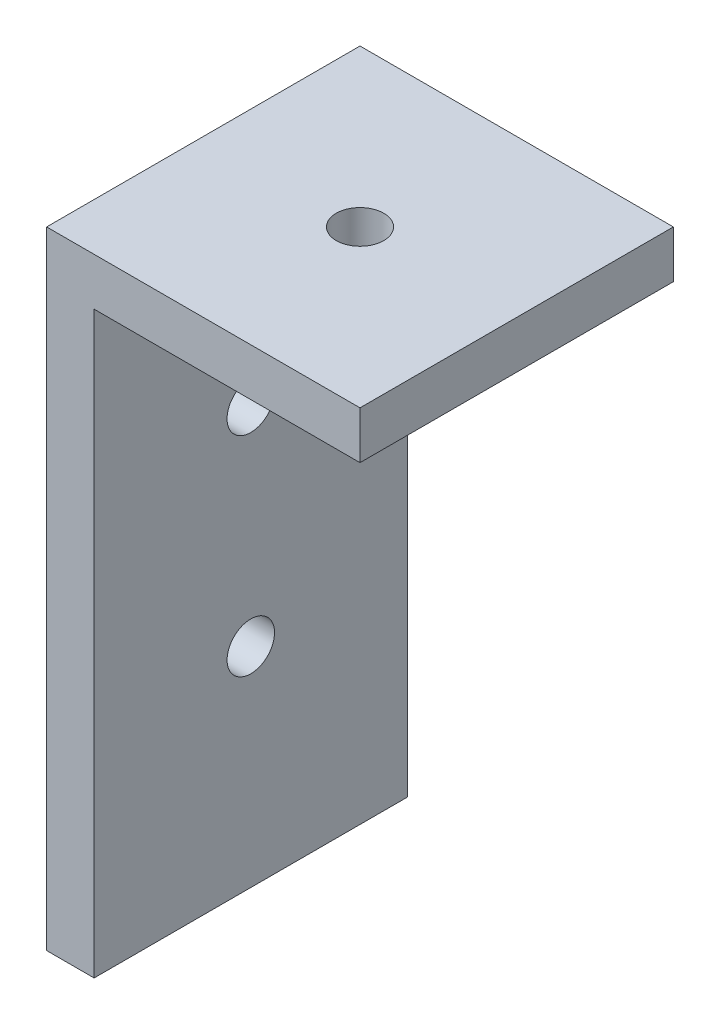
ISO-10303-21;
HEADER;
FILE_DESCRIPTION(('STEP AP214'),'2;1');
FILE_NAME('part.step','',(''),(''),'','','');
FILE_SCHEMA(('AUTOMOTIVE_DESIGN { 1 0 10303 214 1 1 1 1 }'));
ENDSEC;
DATA;
#1=APPLICATION_CONTEXT('core data for automotive mechanical design processes');
#2=APPLICATION_PROTOCOL_DEFINITION('international standard','automotive_design',2000,#1);
#3=PRODUCT_CONTEXT('',#1,'mechanical');
#4=PRODUCT('Part','Part','',(#3));
#5=PRODUCT_RELATED_PRODUCT_CATEGORY('part','',(#4));
#6=PRODUCT_DEFINITION_FORMATION('','',#4);
#7=PRODUCT_DEFINITION_CONTEXT('part definition',#1,'design');
#8=PRODUCT_DEFINITION('design','',#6,#7);
#9=PRODUCT_DEFINITION_SHAPE('','',#8);
#10=(LENGTH_UNIT() NAMED_UNIT(*) SI_UNIT(.MILLI.,.METRE.));
#11=(NAMED_UNIT(*) PLANE_ANGLE_UNIT() SI_UNIT($,.RADIAN.));
#12=(NAMED_UNIT(*) SI_UNIT($,.STERADIAN.) SOLID_ANGLE_UNIT());
#13=UNCERTAINTY_MEASURE_WITH_UNIT(LENGTH_MEASURE(1.E-05),#10,'distance_accuracy_value','');
#14=(GEOMETRIC_REPRESENTATION_CONTEXT(3) GLOBAL_UNCERTAINTY_ASSIGNED_CONTEXT((#13)) GLOBAL_UNIT_ASSIGNED_CONTEXT((#10,
#11,#12)) REPRESENTATION_CONTEXT('',''));
#15=CARTESIAN_POINT('',(0.,0.,0.));
#16=DIRECTION('',(0.,0.,1.));
#17=DIRECTION('',(1.,0.,0.));
#18=AXIS2_PLACEMENT_3D('',#15,#16,#17);
#19=CARTESIAN_POINT('',(-3.,0.,19.8));
#20=DIRECTION('',(0.,1.,0.));
#21=DIRECTION('',(0.,0.,1.));
#22=AXIS2_PLACEMENT_3D('',#19,#20,#21);
#23=PLANE('',#22);
#24=DIRECTION('',(1.,0.,0.));
#25=VECTOR('',#24,1.);
#26=CARTESIAN_POINT('',(-3.,0.,0.));
#27=LINE('',#26,#25);
#28=CARTESIAN_POINT('',(-3.,0.,0.));
#29=VERTEX_POINT('',#28);
#30=CARTESIAN_POINT('',(0.,0.,0.));
#31=VERTEX_POINT('',#30);
#32=EDGE_CURVE('E117',#29,#31,#27,.T.);
#33=ORIENTED_EDGE('',*,*,#32,.T.);
#34=DIRECTION('',(0.,0.,-1.));
#35=VECTOR('',#34,1.);
#36=CARTESIAN_POINT('',(0.,0.,19.8));
#37=LINE('',#36,#35);
#38=CARTESIAN_POINT('',(0.,0.,19.8));
#39=VERTEX_POINT('',#38);
#40=EDGE_CURVE('E11',#39,#31,#37,.T.);
#41=ORIENTED_EDGE('',*,*,#40,.F.);
#42=DIRECTION('',(1.,0.,0.));
#43=VECTOR('',#42,1.);
#44=CARTESIAN_POINT('',(-3.,0.,19.8));
#45=LINE('',#44,#43);
#46=CARTESIAN_POINT('',(-3.,0.,19.8));
#47=VERTEX_POINT('',#46);
#48=EDGE_CURVE('E128',#47,#39,#45,.T.);
#49=ORIENTED_EDGE('',*,*,#48,.F.);
#50=DIRECTION('',(0.,0.,-1.));
#51=VECTOR('',#50,1.);
#52=CARTESIAN_POINT('',(-3.,0.,19.8));
#53=LINE('',#52,#51);
#54=EDGE_CURVE('E113',#47,#29,#53,.T.);
#55=ORIENTED_EDGE('',*,*,#54,.T.);
#56=EDGE_LOOP('',(#33,#41,#49,#55));
#57=FACE_BOUND('',#56,.T.);
#58=ADVANCED_FACE('F33',(#57),#23,.F.);
#59=CARTESIAN_POINT('',(0.,0.,19.8));
#60=DIRECTION('',(-1.,0.,0.));
#61=DIRECTION('',(0.,0.,1.));
#62=AXIS2_PLACEMENT_3D('',#59,#60,#61);
#63=PLANE('',#62);
#64=CARTESIAN_POINT('',(0.,13.2,9.9));
#65=DIRECTION('',(-1.,0.,0.));
#66=DIRECTION('',(0.,0.,1.));
#67=AXIS2_PLACEMENT_3D('',#64,#65,#66);
#68=CIRCLE('',#67,1.5);
#69=CARTESIAN_POINT('',(0.,11.7,9.9));
#70=VERTEX_POINT('',#69);
#71=EDGE_CURVE('E240',#70,#70,#68,.T.);
#72=ORIENTED_EDGE('',*,*,#71,.T.);
#73=EDGE_LOOP('',(#72));
#74=FACE_BOUND('',#73,.T.);
#75=CARTESIAN_POINT('',(0.,26.4,9.9));
#76=DIRECTION('',(-1.,0.,0.));
#77=DIRECTION('',(0.,0.,1.));
#78=AXIS2_PLACEMENT_3D('',#75,#76,#77);
#79=CIRCLE('',#78,1.5);
#80=CARTESIAN_POINT('',(0.,24.9,9.9));
#81=VERTEX_POINT('',#80);
#82=EDGE_CURVE('E244',#81,#81,#79,.T.);
#83=ORIENTED_EDGE('',*,*,#82,.T.);
#84=EDGE_LOOP('',(#83));
#85=FACE_BOUND('',#84,.T.);
#86=DIRECTION('',(0.,1.,0.));
#87=VECTOR('',#86,1.);
#88=CARTESIAN_POINT('',(0.,0.,0.));
#89=LINE('',#88,#87);
#90=CARTESIAN_POINT('',(0.,36.6,0.));
#91=VERTEX_POINT('',#90);
#92=EDGE_CURVE('E120',#31,#91,#89,.T.);
#93=ORIENTED_EDGE('',*,*,#92,.T.);
#94=DIRECTION('',(0.,0.,-1.));
#95=VECTOR('',#94,1.);
#96=CARTESIAN_POINT('',(0.,36.6,19.8));
#97=LINE('',#96,#95);
#98=CARTESIAN_POINT('',(0.,36.6,19.8));
#99=VERTEX_POINT('',#98);
#100=EDGE_CURVE('E41',#99,#91,#97,.T.);
#101=ORIENTED_EDGE('',*,*,#100,.F.);
#102=DIRECTION('',(0.,1.,0.));
#103=VECTOR('',#102,1.);
#104=CARTESIAN_POINT('',(0.,0.,19.8));
#105=LINE('',#104,#103);
#106=EDGE_CURVE('E86',#39,#99,#105,.T.);
#107=ORIENTED_EDGE('',*,*,#106,.F.);
#108=ORIENTED_EDGE('',*,*,#40,.T.);
#109=EDGE_LOOP('',(#93,#101,#107,#108));
#110=FACE_BOUND('',#109,.T.);
#111=ADVANCED_FACE('F156',(#74,#85,#110),#63,.F.);
#112=CARTESIAN_POINT('',(0.,36.6,19.8));
#113=DIRECTION('',(0.,1.,0.));
#114=DIRECTION('',(0.,0.,1.));
#115=AXIS2_PLACEMENT_3D('',#112,#113,#114);
#116=PLANE('',#115);
#117=CARTESIAN_POINT('',(6.9,36.6,9.9));
#118=DIRECTION('',(0.,1.,0.));
#119=DIRECTION('',(0.,0.,1.));
#120=AXIS2_PLACEMENT_3D('',#117,#118,#119);
#121=CIRCLE('',#120,1.5);
#122=CARTESIAN_POINT('',(5.40000000000001,36.6,9.9));
#123=VERTEX_POINT('',#122);
#124=EDGE_CURVE('E121',#123,#123,#121,.T.);
#125=ORIENTED_EDGE('',*,*,#124,.T.);
#126=EDGE_LOOP('',(#125));
#127=FACE_BOUND('',#126,.T.);
#128=DIRECTION('',(1.,0.,0.));
#129=VECTOR('',#128,1.);
#130=CARTESIAN_POINT('',(0.,36.6,0.));
#131=LINE('',#130,#129);
#132=CARTESIAN_POINT('',(16.8,36.6,0.));
#133=VERTEX_POINT('',#132);
#134=EDGE_CURVE('E123',#91,#133,#131,.T.);
#135=ORIENTED_EDGE('',*,*,#134,.T.);
#136=DIRECTION('',(0.,0.,-1.));
#137=VECTOR('',#136,1.);
#138=CARTESIAN_POINT('',(16.8,36.6,19.8));
#139=LINE('',#138,#137);
#140=CARTESIAN_POINT('',(16.8,36.6,19.8));
#141=VERTEX_POINT('',#140);
#142=EDGE_CURVE('E108',#141,#133,#139,.T.);
#143=ORIENTED_EDGE('',*,*,#142,.F.);
#144=DIRECTION('',(1.,0.,0.));
#145=VECTOR('',#144,1.);
#146=CARTESIAN_POINT('',(0.,36.6,19.8));
#147=LINE('',#146,#145);
#148=EDGE_CURVE('E99',#99,#141,#147,.T.);
#149=ORIENTED_EDGE('',*,*,#148,.F.);
#150=ORIENTED_EDGE('',*,*,#100,.T.);
#151=EDGE_LOOP('',(#135,#143,#149,#150));
#152=FACE_BOUND('',#151,.T.);
#153=ADVANCED_FACE('F134',(#127,#152),#116,.F.);
#154=CARTESIAN_POINT('',(16.8,36.6,19.8));
#155=DIRECTION('',(-1.,0.,0.));
#156=DIRECTION('',(0.,-1.,0.));
#157=AXIS2_PLACEMENT_3D('',#154,#155,#156);
#158=PLANE('',#157);
#159=DIRECTION('',(0.,1.,0.));
#160=VECTOR('',#159,1.);
#161=CARTESIAN_POINT('',(16.8,36.6,0.));
#162=LINE('',#161,#160);
#163=CARTESIAN_POINT('',(16.8,39.6,0.));
#164=VERTEX_POINT('',#163);
#165=EDGE_CURVE('E107',#133,#164,#162,.T.);
#166=ORIENTED_EDGE('',*,*,#165,.T.);
#167=DIRECTION('',(0.,0.,-1.));
#168=VECTOR('',#167,1.);
#169=CARTESIAN_POINT('',(16.8,39.6,19.8));
#170=LINE('',#169,#168);
#171=CARTESIAN_POINT('',(16.8,39.6,19.8));
#172=VERTEX_POINT('',#171);
#173=EDGE_CURVE('E104',#172,#164,#170,.T.);
#174=ORIENTED_EDGE('',*,*,#173,.F.);
#175=DIRECTION('',(0.,1.,0.));
#176=VECTOR('',#175,1.);
#177=CARTESIAN_POINT('',(16.8,36.6,19.8));
#178=LINE('',#177,#176);
#179=EDGE_CURVE('E93',#141,#172,#178,.T.);
#180=ORIENTED_EDGE('',*,*,#179,.F.);
#181=ORIENTED_EDGE('',*,*,#142,.T.);
#182=EDGE_LOOP('',(#166,#174,#180,#181));
#183=FACE_BOUND('',#182,.T.);
#184=ADVANCED_FACE('F105',(#183),#158,.F.);
#185=CARTESIAN_POINT('',(16.8,39.6,19.8));
#186=DIRECTION('',(0.,-1.,0.));
#187=DIRECTION('',(1.,0.,0.));
#188=AXIS2_PLACEMENT_3D('',#185,#186,#187);
#189=PLANE('',#188);
#190=CARTESIAN_POINT('',(6.90000000000001,39.6,9.9));
#191=DIRECTION('',(0.,1.,0.));
#192=DIRECTION('',(-1.,0.,0.));
#193=AXIS2_PLACEMENT_3D('',#190,#191,#192);
#194=CIRCLE('',#193,1.5);
#195=CARTESIAN_POINT('',(5.40000000000001,39.6,9.9));
#196=VERTEX_POINT('',#195);
#197=EDGE_CURVE('E250',#196,#196,#194,.T.);
#198=ORIENTED_EDGE('',*,*,#197,.F.);
#199=EDGE_LOOP('',(#198));
#200=FACE_BOUND('',#199,.T.);
#201=DIRECTION('',(-1.,0.,0.));
#202=VECTOR('',#201,1.);
#203=CARTESIAN_POINT('',(16.8,39.6,0.));
#204=LINE('',#203,#202);
#205=CARTESIAN_POINT('',(-3.,39.6,0.));
#206=VERTEX_POINT('',#205);
#207=EDGE_CURVE('E72',#164,#206,#204,.T.);
#208=ORIENTED_EDGE('',*,*,#207,.T.);
#209=DIRECTION('',(0.,0.,-1.));
#210=VECTOR('',#209,1.);
#211=CARTESIAN_POINT('',(-3.,39.6,19.8));
#212=LINE('',#211,#210);
#213=CARTESIAN_POINT('',(-3.,39.6,19.8));
#214=VERTEX_POINT('',#213);
#215=EDGE_CURVE('E109',#214,#206,#212,.T.);
#216=ORIENTED_EDGE('',*,*,#215,.F.);
#217=DIRECTION('',(-1.,0.,0.));
#218=VECTOR('',#217,1.);
#219=CARTESIAN_POINT('',(16.8,39.6,19.8));
#220=LINE('',#219,#218);
#221=EDGE_CURVE('E97',#172,#214,#220,.T.);
#222=ORIENTED_EDGE('',*,*,#221,.F.);
#223=ORIENTED_EDGE('',*,*,#173,.T.);
#224=EDGE_LOOP('',(#208,#216,#222,#223));
#225=FACE_BOUND('',#224,.T.);
#226=ADVANCED_FACE('F111',(#200,#225),#189,.F.);
#227=CARTESIAN_POINT('',(-3.,39.6,19.8));
#228=DIRECTION('',(1.,0.,0.));
#229=DIRECTION('',(0.,1.,0.));
#230=AXIS2_PLACEMENT_3D('',#227,#228,#229);
#231=PLANE('',#230);
#232=CARTESIAN_POINT('',(-3.,13.2,9.9));
#233=DIRECTION('',(-1.,0.,0.));
#234=DIRECTION('',(0.,-1.,0.));
#235=AXIS2_PLACEMENT_3D('',#232,#233,#234);
#236=CIRCLE('',#235,1.5);
#237=CARTESIAN_POINT('',(-3.,11.7,9.9));
#238=VERTEX_POINT('',#237);
#239=EDGE_CURVE('E238',#238,#238,#236,.T.);
#240=ORIENTED_EDGE('',*,*,#239,.F.);
#241=EDGE_LOOP('',(#240));
#242=FACE_BOUND('',#241,.T.);
#243=CARTESIAN_POINT('',(-3.,26.4,9.9));
#244=DIRECTION('',(-1.,0.,0.));
#245=DIRECTION('',(0.,-1.,0.));
#246=AXIS2_PLACEMENT_3D('',#243,#244,#245);
#247=CIRCLE('',#246,1.5);
#248=CARTESIAN_POINT('',(-3.,24.9,9.9));
#249=VERTEX_POINT('',#248);
#250=EDGE_CURVE('E241',#249,#249,#247,.T.);
#251=ORIENTED_EDGE('',*,*,#250,.F.);
#252=EDGE_LOOP('',(#251));
#253=FACE_BOUND('',#252,.T.);
#254=DIRECTION('',(0.,-1.,0.));
#255=VECTOR('',#254,1.);
#256=CARTESIAN_POINT('',(-3.,39.6,0.));
#257=LINE('',#256,#255);
#258=EDGE_CURVE('E78',#206,#29,#257,.T.);
#259=ORIENTED_EDGE('',*,*,#258,.T.);
#260=ORIENTED_EDGE('',*,*,#54,.F.);
#261=DIRECTION('',(0.,-1.,0.));
#262=VECTOR('',#261,1.);
#263=CARTESIAN_POINT('',(-3.,39.6,19.8));
#264=LINE('',#263,#262);
#265=EDGE_CURVE('E49',#214,#47,#264,.T.);
#266=ORIENTED_EDGE('',*,*,#265,.F.);
#267=ORIENTED_EDGE('',*,*,#215,.T.);
#268=EDGE_LOOP('',(#259,#260,#266,#267));
#269=FACE_BOUND('',#268,.T.);
#270=ADVANCED_FACE('F141',(#242,#253,#269),#231,.F.);
#271=CARTESIAN_POINT('',(0.,0.,19.8));
#272=DIRECTION('',(0.,0.,1.));
#273=DIRECTION('',(1.,0.,0.));
#274=AXIS2_PLACEMENT_3D('',#271,#272,#273);
#275=PLANE('',#274);
#276=ORIENTED_EDGE('',*,*,#48,.T.);
#277=ORIENTED_EDGE('',*,*,#106,.T.);
#278=ORIENTED_EDGE('',*,*,#148,.T.);
#279=ORIENTED_EDGE('',*,*,#179,.T.);
#280=ORIENTED_EDGE('',*,*,#221,.T.);
#281=ORIENTED_EDGE('',*,*,#265,.T.);
#282=EDGE_LOOP('',(#276,#277,#278,#279,#280,#281));
#283=FACE_BOUND('',#282,.T.);
#284=ADVANCED_FACE('F95',(#283),#275,.T.);
#285=CARTESIAN_POINT('',(0.,0.,0.));
#286=DIRECTION('',(0.,0.,1.));
#287=DIRECTION('',(1.,0.,0.));
#288=AXIS2_PLACEMENT_3D('',#285,#286,#287);
#289=PLANE('',#288);
#290=ORIENTED_EDGE('',*,*,#32,.F.);
#291=ORIENTED_EDGE('',*,*,#258,.F.);
#292=ORIENTED_EDGE('',*,*,#207,.F.);
#293=ORIENTED_EDGE('',*,*,#165,.F.);
#294=ORIENTED_EDGE('',*,*,#134,.F.);
#295=ORIENTED_EDGE('',*,*,#92,.F.);
#296=EDGE_LOOP('',(#290,#291,#292,#293,#294,#295));
#297=FACE_BOUND('',#296,.T.);
#298=ADVANCED_FACE('F137',(#297),#289,.F.);
#299=CARTESIAN_POINT('',(6.9,19.8,9.9));
#300=DIRECTION('',(0.,1.,0.));
#301=DIRECTION('',(-1.,0.,0.));
#302=AXIS2_PLACEMENT_3D('',#299,#300,#301);
#303=CYLINDRICAL_SURFACE('',#302,1.5);
#304=CARTESIAN_POINT('',(5.40000000000001,39.6,9.9));
#305=CARTESIAN_POINT('',(5.40000000000001,39.56875,9.9));
#306=CARTESIAN_POINT('',(5.40000000000001,39.5375,9.9));
#307=CARTESIAN_POINT('',(5.40000000000001,39.475,9.9));
#308=CARTESIAN_POINT('',(5.40000000000001,39.44375,9.9));
#309=CARTESIAN_POINT('',(5.40000000000001,39.38125,9.9));
#310=CARTESIAN_POINT('',(5.40000000000001,39.35,9.9));
#311=CARTESIAN_POINT('',(5.40000000000001,39.2875,9.9));
#312=CARTESIAN_POINT('',(5.40000000000001,39.25625,9.9));
#313=CARTESIAN_POINT('',(5.40000000000001,39.19375,9.9));
#314=CARTESIAN_POINT('',(5.40000000000001,39.1625,9.9));
#315=CARTESIAN_POINT('',(5.40000000000001,39.1,9.9));
#316=CARTESIAN_POINT('',(5.40000000000001,39.06875,9.9));
#317=CARTESIAN_POINT('',(5.40000000000001,39.00625,9.9));
#318=CARTESIAN_POINT('',(5.40000000000001,38.975,9.9));
#319=CARTESIAN_POINT('',(5.40000000000001,38.9125,9.9));
#320=CARTESIAN_POINT('',(5.40000000000001,38.88125,9.9));
#321=CARTESIAN_POINT('',(5.40000000000001,38.81875,9.9));
#322=CARTESIAN_POINT('',(5.40000000000001,38.7875,9.9));
#323=CARTESIAN_POINT('',(5.40000000000001,38.725,9.9));
#324=CARTESIAN_POINT('',(5.40000000000001,38.69375,9.9));
#325=CARTESIAN_POINT('',(5.40000000000001,38.63125,9.9));
#326=CARTESIAN_POINT('',(5.40000000000001,38.6,9.9));
#327=CARTESIAN_POINT('',(5.40000000000001,38.5375,9.9));
#328=CARTESIAN_POINT('',(5.40000000000001,38.50625,9.9));
#329=CARTESIAN_POINT('',(5.40000000000001,38.44375,9.9));
#330=CARTESIAN_POINT('',(5.40000000000001,38.4125,9.9));
#331=CARTESIAN_POINT('',(5.40000000000001,38.35,9.9));
#332=CARTESIAN_POINT('',(5.40000000000001,38.31875,9.9));
#333=CARTESIAN_POINT('',(5.40000000000001,38.25625,9.9));
#334=CARTESIAN_POINT('',(5.40000000000001,38.225,9.9));
#335=CARTESIAN_POINT('',(5.40000000000001,38.1625,9.9));
#336=CARTESIAN_POINT('',(5.40000000000001,38.13125,9.9));
#337=CARTESIAN_POINT('',(5.40000000000001,38.06875,9.9));
#338=CARTESIAN_POINT('',(5.40000000000001,38.0375,9.9));
#339=CARTESIAN_POINT('',(5.40000000000001,37.975,9.9));
#340=CARTESIAN_POINT('',(5.40000000000001,37.94375,9.9));
#341=CARTESIAN_POINT('',(5.40000000000001,37.88125,9.9));
#342=CARTESIAN_POINT('',(5.40000000000001,37.85,9.9));
#343=CARTESIAN_POINT('',(5.40000000000001,37.7875,9.9));
#344=CARTESIAN_POINT('',(5.40000000000001,37.75625,9.9));
#345=CARTESIAN_POINT('',(5.40000000000001,37.69375,9.9));
#346=CARTESIAN_POINT('',(5.40000000000001,37.6625,9.9));
#347=CARTESIAN_POINT('',(5.40000000000001,37.6,9.9));
#348=CARTESIAN_POINT('',(5.40000000000001,37.56875,9.9));
#349=CARTESIAN_POINT('',(5.40000000000001,37.50625,9.9));
#350=CARTESIAN_POINT('',(5.40000000000001,37.475,9.9));
#351=CARTESIAN_POINT('',(5.40000000000001,37.4125,9.9));
#352=CARTESIAN_POINT('',(5.40000000000001,37.38125,9.9));
#353=CARTESIAN_POINT('',(5.40000000000001,37.31875,9.9));
#354=CARTESIAN_POINT('',(5.40000000000001,37.2875,9.9));
#355=CARTESIAN_POINT('',(5.40000000000001,37.225,9.9));
#356=CARTESIAN_POINT('',(5.40000000000001,37.19375,9.9));
#357=CARTESIAN_POINT('',(5.40000000000001,37.13125,9.9));
#358=CARTESIAN_POINT('',(5.40000000000001,37.1,9.9));
#359=CARTESIAN_POINT('',(5.40000000000001,37.0375,9.9));
#360=CARTESIAN_POINT('',(5.40000000000001,37.00625,9.9));
#361=CARTESIAN_POINT('',(5.40000000000001,36.94375,9.9));
#362=CARTESIAN_POINT('',(5.40000000000001,36.9125,9.9));
#363=CARTESIAN_POINT('',(5.40000000000001,36.85,9.9));
#364=CARTESIAN_POINT('',(5.40000000000001,36.81875,9.9));
#365=CARTESIAN_POINT('',(5.40000000000001,36.75625,9.9));
#366=CARTESIAN_POINT('',(5.40000000000001,36.725,9.9));
#367=CARTESIAN_POINT('',(5.40000000000001,36.6625,9.9));
#368=CARTESIAN_POINT('',(5.40000000000001,36.63125,9.9));
#369=CARTESIAN_POINT('',(5.40000000000001,36.6,9.9));
#370=B_SPLINE_CURVE_WITH_KNOTS('',3,(#304,#305,#306,#307,#308,#309,#310,#311,#312,#313,#314,
#315,#316,#317,#318,#319,#320,#321,#322,#323,#324,#325,#326,#327,#328,#329,#330,#331,#332,#333,
#334,#335,#336,#337,#338,#339,#340,#341,#342,#343,#344,#345,#346,#347,#348,#349,#350,#351,#352,
#353,#354,#355,#356,#357,#358,#359,#360,#361,#362,#363,#364,#365,#366,#367,#368,#369),
.UNSPECIFIED.,.F.,.F.,(4,2,2,2,2,2,2,2,2,2,2,2,2,2,2,2,2,2,2,2,2,2,2,2,2,2,2,2,2,2,2,2,4),(0.,
0.0937499999999966,0.1875,0.281250000000004,0.375,0.468750000000004,0.5625,0.656250000000004,
0.750000000000008,0.843750000000004,0.937500000000001,1.03125,1.12500000000001,1.21875000000001,
1.31250000000001,1.40625,1.50000000000001,1.59375000000001,1.68750000000001,1.78125000000001,
1.87500000000001,1.96875000000001,2.06250000000002,2.15625000000001,2.25000000000001,
2.34375000000001,2.43750000000002,2.53125000000001,2.62500000000002,2.71875000000001,
2.81250000000002,2.90625000000002,3.00000000000002),.UNSPECIFIED.);
#371=EDGE_CURVE('BSEAM188',#196,#123,#370,.T.);
#372=ORIENTED_EDGE('',*,*,#197,.T.);
#373=ORIENTED_EDGE('',*,*,#124,.F.);
#374=ORIENTED_EDGE('',*,*,#371,.T.);
#375=ORIENTED_EDGE('',*,*,#371,.F.);
#376=EDGE_LOOP('',(#372,#374,#373,#375));
#377=FACE_BOUND('',#376,.T.);
#378=ADVANCED_FACE('F188',(#377),#303,.F.);
#379=CARTESIAN_POINT('',(16.8,26.4,9.9));
#380=DIRECTION('',(-1.,0.,0.));
#381=DIRECTION('',(0.,-1.,0.));
#382=AXIS2_PLACEMENT_3D('',#379,#380,#381);
#383=CYLINDRICAL_SURFACE('',#382,1.5);
#384=CARTESIAN_POINT('',(-3.,24.9,9.9));
#385=CARTESIAN_POINT('',(-2.96875,24.9,9.9));
#386=CARTESIAN_POINT('',(-2.9375,24.9,9.9));
#387=CARTESIAN_POINT('',(-2.875,24.9,9.9));
#388=CARTESIAN_POINT('',(-2.84375,24.9,9.9));
#389=CARTESIAN_POINT('',(-2.78125,24.9,9.9));
#390=CARTESIAN_POINT('',(-2.75,24.9,9.9));
#391=CARTESIAN_POINT('',(-2.6875,24.9,9.9));
#392=CARTESIAN_POINT('',(-2.65625,24.9,9.9));
#393=CARTESIAN_POINT('',(-2.59375,24.9,9.9));
#394=CARTESIAN_POINT('',(-2.5625,24.9,9.9));
#395=CARTESIAN_POINT('',(-2.5,24.9,9.9));
#396=CARTESIAN_POINT('',(-2.46875,24.9,9.9));
#397=CARTESIAN_POINT('',(-2.40625,24.9,9.9));
#398=CARTESIAN_POINT('',(-2.375,24.9,9.9));
#399=CARTESIAN_POINT('',(-2.3125,24.9,9.9));
#400=CARTESIAN_POINT('',(-2.28125,24.9,9.9));
#401=CARTESIAN_POINT('',(-2.21875,24.9,9.9));
#402=CARTESIAN_POINT('',(-2.1875,24.9,9.9));
#403=CARTESIAN_POINT('',(-2.125,24.9,9.9));
#404=CARTESIAN_POINT('',(-2.09375,24.9,9.9));
#405=CARTESIAN_POINT('',(-2.03125,24.9,9.9));
#406=CARTESIAN_POINT('',(-2.,24.9,9.9));
#407=CARTESIAN_POINT('',(-1.9375,24.9,9.9));
#408=CARTESIAN_POINT('',(-1.90625,24.9,9.9));
#409=CARTESIAN_POINT('',(-1.84375,24.9,9.9));
#410=CARTESIAN_POINT('',(-1.8125,24.9,9.9));
#411=CARTESIAN_POINT('',(-1.75,24.9,9.9));
#412=CARTESIAN_POINT('',(-1.71875,24.9,9.9));
#413=CARTESIAN_POINT('',(-1.65625,24.9,9.9));
#414=CARTESIAN_POINT('',(-1.625,24.9,9.9));
#415=CARTESIAN_POINT('',(-1.5625,24.9,9.9));
#416=CARTESIAN_POINT('',(-1.53125,24.9,9.9));
#417=CARTESIAN_POINT('',(-1.46875,24.9,9.9));
#418=CARTESIAN_POINT('',(-1.4375,24.9,9.9));
#419=CARTESIAN_POINT('',(-1.375,24.9,9.9));
#420=CARTESIAN_POINT('',(-1.34375,24.9,9.9));
#421=CARTESIAN_POINT('',(-1.28125,24.9,9.9));
#422=CARTESIAN_POINT('',(-1.25,24.9,9.9));
#423=CARTESIAN_POINT('',(-1.1875,24.9,9.9));
#424=CARTESIAN_POINT('',(-1.15625,24.9,9.9));
#425=CARTESIAN_POINT('',(-1.09375,24.9,9.9));
#426=CARTESIAN_POINT('',(-1.0625,24.9,9.9));
#427=CARTESIAN_POINT('',(-0.999999999999997,24.9,9.9));
#428=CARTESIAN_POINT('',(-0.968749999999997,24.9,9.9));
#429=CARTESIAN_POINT('',(-0.906249999999997,24.9,9.9));
#430=CARTESIAN_POINT('',(-0.874999999999997,24.9,9.9));
#431=CARTESIAN_POINT('',(-0.812499999999996,24.9,9.9));
#432=CARTESIAN_POINT('',(-0.781249999999995,24.9,9.9));
#433=CARTESIAN_POINT('',(-0.718749999999995,24.9,9.9));
#434=CARTESIAN_POINT('',(-0.687499999999996,24.9,9.9));
#435=CARTESIAN_POINT('',(-0.624999999999996,24.9,9.9));
#436=CARTESIAN_POINT('',(-0.593749999999995,24.9,9.9));
#437=CARTESIAN_POINT('',(-0.531249999999994,24.9,9.9));
#438=CARTESIAN_POINT('',(-0.499999999999994,24.9,9.9));
#439=CARTESIAN_POINT('',(-0.437499999999993,24.9,9.9));
#440=CARTESIAN_POINT('',(-0.406249999999993,24.9,9.9));
#441=CARTESIAN_POINT('',(-0.343749999999993,24.9,9.9));
#442=CARTESIAN_POINT('',(-0.312499999999993,24.9,9.9));
#443=CARTESIAN_POINT('',(-0.249999999999993,24.9,9.9));
#444=CARTESIAN_POINT('',(-0.218749999999993,24.9,9.9));
#445=CARTESIAN_POINT('',(-0.156249999999993,24.9,9.9));
#446=CARTESIAN_POINT('',(-0.124999999999993,24.9,9.9));
#447=CARTESIAN_POINT('',(-0.0624999999999931,24.9,9.9));
#448=CARTESIAN_POINT('',(-0.0312499999999931,24.9,9.9));
#449=CARTESIAN_POINT('',(0.,24.9,9.9));
#450=B_SPLINE_CURVE_WITH_KNOTS('',3,(#384,#385,#386,#387,#388,#389,#390,#391,#392,#393,#394,
#395,#396,#397,#398,#399,#400,#401,#402,#403,#404,#405,#406,#407,#408,#409,#410,#411,#412,#413,
#414,#415,#416,#417,#418,#419,#420,#421,#422,#423,#424,#425,#426,#427,#428,#429,#430,#431,#432,
#433,#434,#435,#436,#437,#438,#439,#440,#441,#442,#443,#444,#445,#446,#447,#448,#449),
.UNSPECIFIED.,.F.,.F.,(4,2,2,2,2,2,2,2,2,2,2,2,2,2,2,2,2,2,2,2,2,2,2,2,2,2,2,2,2,2,2,2,4),(0.,
0.0937500000000001,0.1875,0.28125,0.375,0.46875,0.5625,0.656250000000001,0.750000000000001,
0.843750000000004,0.937500000000004,1.03125,1.125,1.21875,1.3125,1.40625,1.5,1.59375,1.6875,
1.78125000000001,1.87500000000001,1.96875000000001,2.06250000000001,2.15625000000001,
2.25000000000001,2.34375000000001,2.43750000000001,2.53125000000001,2.62500000000001,
2.71875000000001,2.81250000000001,2.90625000000001,3.00000000000001),.UNSPECIFIED.);
#451=EDGE_CURVE('BSEAM192',#249,#81,#450,.T.);
#452=ORIENTED_EDGE('',*,*,#250,.T.);
#453=ORIENTED_EDGE('',*,*,#82,.F.);
#454=ORIENTED_EDGE('',*,*,#451,.T.);
#455=ORIENTED_EDGE('',*,*,#451,.F.);
#456=EDGE_LOOP('',(#452,#454,#453,#455));
#457=FACE_BOUND('',#456,.T.);
#458=ADVANCED_FACE('F192',(#457),#383,.F.);
#459=CARTESIAN_POINT('',(16.8,13.2,9.9));
#460=DIRECTION('',(-1.,0.,0.));
#461=DIRECTION('',(0.,-1.,0.));
#462=AXIS2_PLACEMENT_3D('',#459,#460,#461);
#463=CYLINDRICAL_SURFACE('',#462,1.5);
#464=CARTESIAN_POINT('',(-3.,11.7,9.9));
#465=CARTESIAN_POINT('',(-2.96875,11.7,9.9));
#466=CARTESIAN_POINT('',(-2.9375,11.7,9.9));
#467=CARTESIAN_POINT('',(-2.875,11.7,9.9));
#468=CARTESIAN_POINT('',(-2.84375,11.7,9.9));
#469=CARTESIAN_POINT('',(-2.78125,11.7,9.9));
#470=CARTESIAN_POINT('',(-2.75,11.7,9.9));
#471=CARTESIAN_POINT('',(-2.6875,11.7,9.9));
#472=CARTESIAN_POINT('',(-2.65625,11.7,9.9));
#473=CARTESIAN_POINT('',(-2.59375,11.7,9.9));
#474=CARTESIAN_POINT('',(-2.5625,11.7,9.9));
#475=CARTESIAN_POINT('',(-2.5,11.7,9.9));
#476=CARTESIAN_POINT('',(-2.46875,11.7,9.9));
#477=CARTESIAN_POINT('',(-2.40625,11.7,9.9));
#478=CARTESIAN_POINT('',(-2.375,11.7,9.9));
#479=CARTESIAN_POINT('',(-2.3125,11.7,9.9));
#480=CARTESIAN_POINT('',(-2.28125,11.7,9.9));
#481=CARTESIAN_POINT('',(-2.21875,11.7,9.9));
#482=CARTESIAN_POINT('',(-2.1875,11.7,9.9));
#483=CARTESIAN_POINT('',(-2.125,11.7,9.9));
#484=CARTESIAN_POINT('',(-2.09375,11.7,9.9));
#485=CARTESIAN_POINT('',(-2.03125,11.7,9.9));
#486=CARTESIAN_POINT('',(-2.,11.7,9.9));
#487=CARTESIAN_POINT('',(-1.9375,11.7,9.9));
#488=CARTESIAN_POINT('',(-1.90625,11.7,9.9));
#489=CARTESIAN_POINT('',(-1.84375,11.7,9.9));
#490=CARTESIAN_POINT('',(-1.8125,11.7,9.9));
#491=CARTESIAN_POINT('',(-1.75,11.7,9.9));
#492=CARTESIAN_POINT('',(-1.71875,11.7,9.9));
#493=CARTESIAN_POINT('',(-1.65625,11.7,9.9));
#494=CARTESIAN_POINT('',(-1.625,11.7,9.9));
#495=CARTESIAN_POINT('',(-1.5625,11.7,9.9));
#496=CARTESIAN_POINT('',(-1.53125,11.7,9.9));
#497=CARTESIAN_POINT('',(-1.46875,11.7,9.9));
#498=CARTESIAN_POINT('',(-1.4375,11.7,9.9));
#499=CARTESIAN_POINT('',(-1.375,11.7,9.9));
#500=CARTESIAN_POINT('',(-1.34375,11.7,9.9));
#501=CARTESIAN_POINT('',(-1.28125,11.7,9.9));
#502=CARTESIAN_POINT('',(-1.25,11.7,9.9));
#503=CARTESIAN_POINT('',(-1.1875,11.7,9.9));
#504=CARTESIAN_POINT('',(-1.15625,11.7,9.9));
#505=CARTESIAN_POINT('',(-1.09375,11.7,9.9));
#506=CARTESIAN_POINT('',(-1.0625,11.7,9.9));
#507=CARTESIAN_POINT('',(-0.999999999999997,11.7,9.9));
#508=CARTESIAN_POINT('',(-0.968749999999997,11.7,9.9));
#509=CARTESIAN_POINT('',(-0.906249999999997,11.7,9.9));
#510=CARTESIAN_POINT('',(-0.874999999999997,11.7,9.9));
#511=CARTESIAN_POINT('',(-0.812499999999996,11.7,9.9));
#512=CARTESIAN_POINT('',(-0.781249999999995,11.7,9.9));
#513=CARTESIAN_POINT('',(-0.718749999999995,11.7,9.9));
#514=CARTESIAN_POINT('',(-0.687499999999996,11.7,9.9));
#515=CARTESIAN_POINT('',(-0.624999999999996,11.7,9.9));
#516=CARTESIAN_POINT('',(-0.593749999999995,11.7,9.9));
#517=CARTESIAN_POINT('',(-0.531249999999994,11.7,9.9));
#518=CARTESIAN_POINT('',(-0.499999999999994,11.7,9.9));
#519=CARTESIAN_POINT('',(-0.437499999999993,11.7,9.9));
#520=CARTESIAN_POINT('',(-0.406249999999993,11.7,9.9));
#521=CARTESIAN_POINT('',(-0.343749999999993,11.7,9.9));
#522=CARTESIAN_POINT('',(-0.312499999999993,11.7,9.9));
#523=CARTESIAN_POINT('',(-0.249999999999993,11.7,9.9));
#524=CARTESIAN_POINT('',(-0.218749999999993,11.7,9.9));
#525=CARTESIAN_POINT('',(-0.156249999999993,11.7,9.9));
#526=CARTESIAN_POINT('',(-0.124999999999993,11.7,9.9));
#527=CARTESIAN_POINT('',(-0.0624999999999931,11.7,9.9));
#528=CARTESIAN_POINT('',(-0.0312499999999931,11.7,9.9));
#529=CARTESIAN_POINT('',(0.,11.7,9.9));
#530=B_SPLINE_CURVE_WITH_KNOTS('',3,(#464,#465,#466,#467,#468,#469,#470,#471,#472,#473,#474,
#475,#476,#477,#478,#479,#480,#481,#482,#483,#484,#485,#486,#487,#488,#489,#490,#491,#492,#493,
#494,#495,#496,#497,#498,#499,#500,#501,#502,#503,#504,#505,#506,#507,#508,#509,#510,#511,#512,
#513,#514,#515,#516,#517,#518,#519,#520,#521,#522,#523,#524,#525,#526,#527,#528,#529),
.UNSPECIFIED.,.F.,.F.,(4,2,2,2,2,2,2,2,2,2,2,2,2,2,2,2,2,2,2,2,2,2,2,2,2,2,2,2,2,2,2,2,4),(0.,
0.0937500000000001,0.1875,0.28125,0.375,0.46875,0.5625,0.656250000000001,0.750000000000001,
0.843750000000004,0.937500000000004,1.03125,1.125,1.21875,1.3125,1.40625,1.5,1.59375,1.6875,
1.78125000000001,1.87500000000001,1.96875000000001,2.06250000000001,2.15625000000001,
2.25000000000001,2.34375000000001,2.43750000000001,2.53125000000001,2.62500000000001,
2.71875000000001,2.81250000000001,2.90625000000001,3.00000000000001),.UNSPECIFIED.);
#531=EDGE_CURVE('BSEAM214',#238,#70,#530,.T.);
#532=ORIENTED_EDGE('',*,*,#239,.T.);
#533=ORIENTED_EDGE('',*,*,#71,.F.);
#534=ORIENTED_EDGE('',*,*,#531,.T.);
#535=ORIENTED_EDGE('',*,*,#531,.F.);
#536=EDGE_LOOP('',(#532,#534,#533,#535));
#537=FACE_BOUND('',#536,.T.);
#538=ADVANCED_FACE('F214',(#537),#463,.F.);
#539=CLOSED_SHELL('',(#58,#111,#153,#184,#226,#270,#284,#298,#378,#458,#538));
#540=MANIFOLD_SOLID_BREP('B2',#539);
#541=ADVANCED_BREP_SHAPE_REPRESENTATION('',(#18,#540),#14);
#542=SHAPE_DEFINITION_REPRESENTATION(#9,#541);
ENDSEC;
END-ISO-10303-21;
